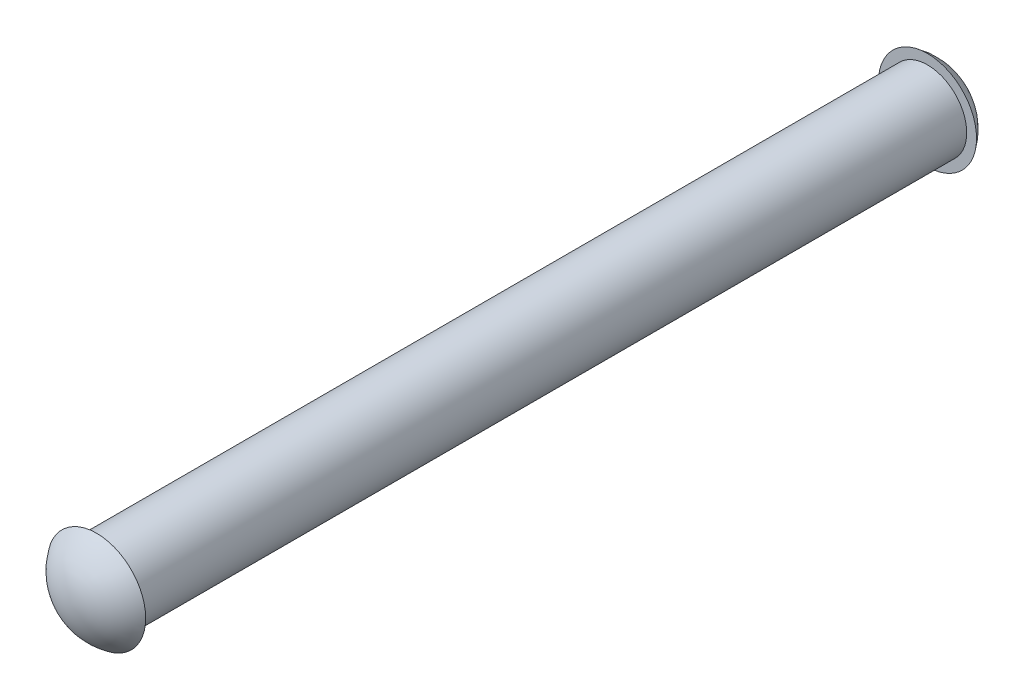
ISO-10303-21;
HEADER;
FILE_DESCRIPTION(('STEP AP214'),'2;1');
FILE_NAME('part.step','',(''),(''),'','','');
FILE_SCHEMA(('AUTOMOTIVE_DESIGN { 1 0 10303 214 1 1 1 1 }'));
ENDSEC;
DATA;
#1=APPLICATION_CONTEXT('core data for automotive mechanical design processes');
#2=APPLICATION_PROTOCOL_DEFINITION('international standard','automotive_design',2000,#1);
#3=PRODUCT_CONTEXT('',#1,'mechanical');
#4=PRODUCT('Part','Part','',(#3));
#5=PRODUCT_RELATED_PRODUCT_CATEGORY('part','',(#4));
#6=PRODUCT_DEFINITION_FORMATION('','',#4);
#7=PRODUCT_DEFINITION_CONTEXT('part definition',#1,'design');
#8=PRODUCT_DEFINITION('design','',#6,#7);
#9=PRODUCT_DEFINITION_SHAPE('','',#8);
#10=(LENGTH_UNIT() NAMED_UNIT(*) SI_UNIT(.MILLI.,.METRE.));
#11=(NAMED_UNIT(*) PLANE_ANGLE_UNIT() SI_UNIT($,.RADIAN.));
#12=(NAMED_UNIT(*) SI_UNIT($,.STERADIAN.) SOLID_ANGLE_UNIT());
#13=UNCERTAINTY_MEASURE_WITH_UNIT(LENGTH_MEASURE(1.E-05),#10,'distance_accuracy_value','');
#14=(GEOMETRIC_REPRESENTATION_CONTEXT(3) GLOBAL_UNCERTAINTY_ASSIGNED_CONTEXT((#13)) GLOBAL_UNIT_ASSIGNED_CONTEXT((#10,
#11,#12)) REPRESENTATION_CONTEXT('',''));
#15=CARTESIAN_POINT('',(0.,0.,0.));
#16=DIRECTION('',(0.,0.,1.));
#17=DIRECTION('',(1.,0.,0.));
#18=AXIS2_PLACEMENT_3D('',#15,#16,#17);
#19=CARTESIAN_POINT('',(0.,0.,12.7));
#20=DIRECTION('',(0.,0.,-1.));
#21=DIRECTION('',(-1.,0.,0.));
#22=AXIS2_PLACEMENT_3D('',#19,#20,#21);
#23=CYLINDRICAL_SURFACE('',#22,1.2);
#24=CARTESIAN_POINT('',(0.,0.,12.7));
#25=DIRECTION('',(0.,0.,1.));
#26=DIRECTION('',(1.,0.,0.));
#27=AXIS2_PLACEMENT_3D('',#24,#25,#26);
#28=CIRCLE('',#27,1.2);
#29=CARTESIAN_POINT('',(1.2,0.,12.7));
#30=VERTEX_POINT('',#29);
#31=EDGE_CURVE('E10',#30,#30,#28,.T.);
#32=ORIENTED_EDGE('',*,*,#31,.F.);
#33=EDGE_LOOP('',(#32));
#34=FACE_BOUND('',#33,.T.);
#35=CARTESIAN_POINT('',(0.,0.,-12.7));
#36=DIRECTION('',(0.,0.,-1.));
#37=DIRECTION('',(-1.,0.,0.));
#38=AXIS2_PLACEMENT_3D('',#35,#36,#37);
#39=CIRCLE('',#38,1.2);
#40=CARTESIAN_POINT('',(-1.2,0.,-12.7));
#41=VERTEX_POINT('',#40);
#42=EDGE_CURVE('E57',#41,#41,#39,.T.);
#43=ORIENTED_EDGE('',*,*,#42,.F.);
#44=EDGE_LOOP('',(#43));
#45=FACE_BOUND('',#44,.T.);
#46=ADVANCED_FACE('F45',(#34,#45),#23,.T.);
#47=CARTESIAN_POINT('',(0.,0.,11.69375));
#48=DIRECTION('',(0.,0.,1.));
#49=DIRECTION('',(-1.,0.,0.));
#50=AXIS2_PLACEMENT_3D('',#47,#48,#49);
#51=SPHERICAL_SURFACE('',#50,1.80625);
#52=CARTESIAN_POINT('',(0.,0.,12.7));
#53=DIRECTION('',(0.,0.,1.));
#54=DIRECTION('',(1.,0.,0.));
#55=AXIS2_PLACEMENT_3D('',#52,#53,#54);
#56=CIRCLE('',#55,1.5);
#57=CARTESIAN_POINT('',(1.5,0.,12.7));
#58=VERTEX_POINT('',#57);
#59=EDGE_CURVE('E52',#58,#58,#56,.T.);
#60=ORIENTED_EDGE('',*,*,#59,.T.);
#61=EDGE_LOOP('',(#60));
#62=FACE_BOUND('',#61,.T.);
#63=ADVANCED_FACE('F81',(#62),#51,.T.);
#64=CARTESIAN_POINT('',(0.,0.,12.7));
#65=DIRECTION('',(0.,0.,1.));
#66=DIRECTION('',(1.,0.,0.));
#67=AXIS2_PLACEMENT_3D('',#64,#65,#66);
#68=PLANE('',#67);
#69=ORIENTED_EDGE('',*,*,#31,.T.);
#70=EDGE_LOOP('',(#69));
#71=FACE_BOUND('',#70,.T.);
#72=ORIENTED_EDGE('',*,*,#59,.F.);
#73=EDGE_LOOP('',(#72));
#74=FACE_BOUND('',#73,.T.);
#75=ADVANCED_FACE('F73',(#71,#74),#68,.F.);
#76=CARTESIAN_POINT('',(0.,0.,-11.69375));
#77=DIRECTION('',(0.,0.,-1.));
#78=DIRECTION('',(-1.,0.,0.));
#79=AXIS2_PLACEMENT_3D('',#76,#77,#78);
#80=SPHERICAL_SURFACE('',#79,1.80625);
#81=CARTESIAN_POINT('',(0.,0.,-12.7));
#82=DIRECTION('',(0.,0.,1.));
#83=DIRECTION('',(1.,0.,0.));
#84=AXIS2_PLACEMENT_3D('',#81,#82,#83);
#85=CIRCLE('',#84,1.5);
#86=CARTESIAN_POINT('',(1.5,0.,-12.7));
#87=VERTEX_POINT('',#86);
#88=EDGE_CURVE('E62',#87,#87,#85,.T.);
#89=ORIENTED_EDGE('',*,*,#88,.F.);
#90=EDGE_LOOP('',(#89));
#91=FACE_BOUND('',#90,.T.);
#92=ADVANCED_FACE('F71',(#91),#80,.T.);
#93=CARTESIAN_POINT('',(0.,0.,-12.7));
#94=DIRECTION('',(0.,0.,-1.));
#95=DIRECTION('',(1.,0.,0.));
#96=AXIS2_PLACEMENT_3D('',#93,#94,#95);
#97=PLANE('',#96);
#98=ORIENTED_EDGE('',*,*,#42,.T.);
#99=EDGE_LOOP('',(#98));
#100=FACE_BOUND('',#99,.T.);
#101=ORIENTED_EDGE('',*,*,#88,.T.);
#102=EDGE_LOOP('',(#101));
#103=FACE_BOUND('',#102,.T.);
#104=ADVANCED_FACE('F69',(#100,#103),#97,.F.);
#105=CLOSED_SHELL('',(#46,#63,#75,#92,#104));
#106=MANIFOLD_SOLID_BREP('B2',#105);
#107=ADVANCED_BREP_SHAPE_REPRESENTATION('',(#18,#106),#14);
#108=SHAPE_DEFINITION_REPRESENTATION(#9,#107);
ENDSEC;
END-ISO-10303-21;
